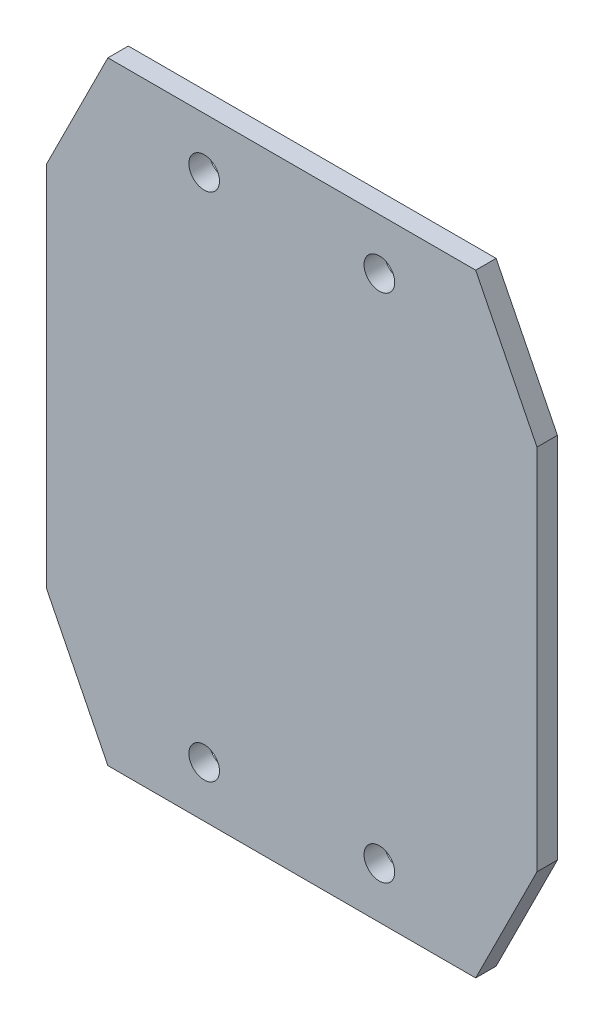
ISO-10303-21;
HEADER;
FILE_DESCRIPTION(('STEP AP214'),'2;1');
FILE_NAME('part.step','',(''),(''),'','','');
FILE_SCHEMA(('AUTOMOTIVE_DESIGN { 1 0 10303 214 1 1 1 1 }'));
ENDSEC;
DATA;
#1=APPLICATION_CONTEXT('core data for automotive mechanical design processes');
#2=APPLICATION_PROTOCOL_DEFINITION('international standard','automotive_design',2000,#1);
#3=PRODUCT_CONTEXT('',#1,'mechanical');
#4=PRODUCT('Part','Part','',(#3));
#5=PRODUCT_RELATED_PRODUCT_CATEGORY('part','',(#4));
#6=PRODUCT_DEFINITION_FORMATION('','',#4);
#7=PRODUCT_DEFINITION_CONTEXT('part definition',#1,'design');
#8=PRODUCT_DEFINITION('design','',#6,#7);
#9=PRODUCT_DEFINITION_SHAPE('','',#8);
#10=(LENGTH_UNIT() NAMED_UNIT(*) SI_UNIT(.MILLI.,.METRE.));
#11=(NAMED_UNIT(*) PLANE_ANGLE_UNIT() SI_UNIT($,.RADIAN.));
#12=(NAMED_UNIT(*) SI_UNIT($,.STERADIAN.) SOLID_ANGLE_UNIT());
#13=UNCERTAINTY_MEASURE_WITH_UNIT(LENGTH_MEASURE(1.E-05),#10,'distance_accuracy_value','');
#14=(GEOMETRIC_REPRESENTATION_CONTEXT(3) GLOBAL_UNCERTAINTY_ASSIGNED_CONTEXT((#13)) GLOBAL_UNIT_ASSIGNED_CONTEXT((#10,
#11,#12)) REPRESENTATION_CONTEXT('',''));
#15=CARTESIAN_POINT('',(0.,0.,0.));
#16=DIRECTION('',(0.,0.,1.));
#17=DIRECTION('',(1.,0.,0.));
#18=AXIS2_PLACEMENT_3D('',#15,#16,#17);
#19=CARTESIAN_POINT('',(0.,0.,10.));
#20=DIRECTION('',(0.,0.,-1.));
#21=DIRECTION('',(-1.,0.,0.));
#22=AXIS2_PLACEMENT_3D('',#19,#20,#21);
#23=PLANE('',#22);
#24=DIRECTION('',(-0.447213595499958,-0.894427190999916,0.));
#25=VECTOR('',#24,1.);
#26=CARTESIAN_POINT('',(-120.,90.,10.));
#27=LINE('',#26,#25);
#28=CARTESIAN_POINT('',(-90.,150.,10.));
#29=VERTEX_POINT('',#28);
#30=CARTESIAN_POINT('',(-120.,90.,10.));
#31=VERTEX_POINT('',#30);
#32=EDGE_CURVE('E144',#29,#31,#27,.T.);
#33=ORIENTED_EDGE('',*,*,#32,.T.);
#34=DIRECTION('',(0.,-1.,0.));
#35=VECTOR('',#34,1.);
#36=CARTESIAN_POINT('',(-120.,-90.,10.));
#37=LINE('',#36,#35);
#38=CARTESIAN_POINT('',(-120.,-90.,10.));
#39=VERTEX_POINT('',#38);
#40=EDGE_CURVE('E92',#31,#39,#37,.T.);
#41=ORIENTED_EDGE('',*,*,#40,.T.);
#42=DIRECTION('',(0.447213595499958,-0.894427190999916,0.));
#43=VECTOR('',#42,1.);
#44=CARTESIAN_POINT('',(-90.,-150.,10.));
#45=LINE('',#44,#43);
#46=CARTESIAN_POINT('',(-90.,-150.,10.));
#47=VERTEX_POINT('',#46);
#48=EDGE_CURVE('E159',#39,#47,#45,.T.);
#49=ORIENTED_EDGE('',*,*,#48,.T.);
#50=DIRECTION('',(1.,0.,0.));
#51=VECTOR('',#50,1.);
#52=CARTESIAN_POINT('',(90.,-150.,10.));
#53=LINE('',#52,#51);
#54=CARTESIAN_POINT('',(90.,-150.,10.));
#55=VERTEX_POINT('',#54);
#56=EDGE_CURVE('E172',#47,#55,#53,.T.);
#57=ORIENTED_EDGE('',*,*,#56,.T.);
#58=DIRECTION('',(0.447213595499958,0.894427190999916,0.));
#59=VECTOR('',#58,1.);
#60=CARTESIAN_POINT('',(120.,-90.,10.));
#61=LINE('',#60,#59);
#62=CARTESIAN_POINT('',(120.,-90.,10.));
#63=VERTEX_POINT('',#62);
#64=EDGE_CURVE('E111',#55,#63,#61,.T.);
#65=ORIENTED_EDGE('',*,*,#64,.T.);
#66=DIRECTION('',(0.,1.,0.));
#67=VECTOR('',#66,1.);
#68=CARTESIAN_POINT('',(120.,90.,10.));
#69=LINE('',#68,#67);
#70=CARTESIAN_POINT('',(120.,90.,10.));
#71=VERTEX_POINT('',#70);
#72=EDGE_CURVE('E105',#63,#71,#69,.T.);
#73=ORIENTED_EDGE('',*,*,#72,.T.);
#74=DIRECTION('',(-0.447213595499958,0.894427190999916,0.));
#75=VECTOR('',#74,1.);
#76=CARTESIAN_POINT('',(90.,150.,10.));
#77=LINE('',#76,#75);
#78=CARTESIAN_POINT('',(90.,150.,10.));
#79=VERTEX_POINT('',#78);
#80=EDGE_CURVE('E109',#71,#79,#77,.T.);
#81=ORIENTED_EDGE('',*,*,#80,.T.);
#82=DIRECTION('',(-1.,0.,0.));
#83=VECTOR('',#82,1.);
#84=CARTESIAN_POINT('',(-90.,150.,10.));
#85=LINE('',#84,#83);
#86=EDGE_CURVE('E49',#79,#29,#85,.T.);
#87=ORIENTED_EDGE('',*,*,#86,.T.);
#88=EDGE_LOOP('',(#33,#41,#49,#57,#65,#73,#81,#87));
#89=FACE_BOUND('',#88,.T.);
#90=CARTESIAN_POINT('',(42.8625,125.,10.));
#91=DIRECTION('',(0.,0.,1.));
#92=DIRECTION('',(1.,0.,0.));
#93=AXIS2_PLACEMENT_3D('',#90,#91,#92);
#94=CIRCLE('',#93,7.5);
#95=CARTESIAN_POINT('',(50.3625,125.,10.));
#96=VERTEX_POINT('',#95);
#97=EDGE_CURVE('E133',#96,#96,#94,.T.);
#98=ORIENTED_EDGE('',*,*,#97,.F.);
#99=EDGE_LOOP('',(#98));
#100=FACE_BOUND('',#99,.T.);
#101=CARTESIAN_POINT('',(-42.8625,125.,10.));
#102=DIRECTION('',(0.,0.,1.));
#103=DIRECTION('',(1.,0.,0.));
#104=AXIS2_PLACEMENT_3D('',#101,#102,#103);
#105=CIRCLE('',#104,7.5);
#106=CARTESIAN_POINT('',(-35.3625,125.,10.));
#107=VERTEX_POINT('',#106);
#108=EDGE_CURVE('E181',#107,#107,#105,.T.);
#109=ORIENTED_EDGE('',*,*,#108,.F.);
#110=EDGE_LOOP('',(#109));
#111=FACE_BOUND('',#110,.T.);
#112=CARTESIAN_POINT('',(-42.8625,-125.,10.));
#113=DIRECTION('',(0.,0.,1.));
#114=DIRECTION('',(1.,0.,0.));
#115=AXIS2_PLACEMENT_3D('',#112,#113,#114);
#116=CIRCLE('',#115,7.5);
#117=CARTESIAN_POINT('',(-35.3625,-125.,10.));
#118=VERTEX_POINT('',#117);
#119=EDGE_CURVE('E187',#118,#118,#116,.T.);
#120=ORIENTED_EDGE('',*,*,#119,.F.);
#121=EDGE_LOOP('',(#120));
#122=FACE_BOUND('',#121,.T.);
#123=CARTESIAN_POINT('',(42.8625,-125.,10.));
#124=DIRECTION('',(0.,0.,1.));
#125=DIRECTION('',(1.,0.,0.));
#126=AXIS2_PLACEMENT_3D('',#123,#124,#125);
#127=CIRCLE('',#126,7.5);
#128=CARTESIAN_POINT('',(50.3625,-125.,10.));
#129=VERTEX_POINT('',#128);
#130=EDGE_CURVE('E193',#129,#129,#127,.T.);
#131=ORIENTED_EDGE('',*,*,#130,.F.);
#132=EDGE_LOOP('',(#131));
#133=FACE_BOUND('',#132,.T.);
#134=ADVANCED_FACE('F32',(#89,#100,#111,#122,#133),#23,.F.);
#135=CARTESIAN_POINT('',(0.,0.,0.));
#136=DIRECTION('',(0.,0.,-1.));
#137=DIRECTION('',(-1.,0.,0.));
#138=AXIS2_PLACEMENT_3D('',#135,#136,#137);
#139=PLANE('',#138);
#140=CARTESIAN_POINT('',(-42.8625,-125.,0.));
#141=DIRECTION('',(0.,0.,1.));
#142=DIRECTION('',(1.,0.,0.));
#143=AXIS2_PLACEMENT_3D('',#140,#141,#142);
#144=CIRCLE('',#143,7.5);
#145=CARTESIAN_POINT('',(-35.3625,-125.,0.));
#146=VERTEX_POINT('',#145);
#147=EDGE_CURVE('E190',#146,#146,#144,.T.);
#148=ORIENTED_EDGE('',*,*,#147,.T.);
#149=EDGE_LOOP('',(#148));
#150=FACE_BOUND('',#149,.T.);
#151=CARTESIAN_POINT('',(42.8625,125.,0.));
#152=DIRECTION('',(0.,0.,1.));
#153=DIRECTION('',(1.,0.,0.));
#154=AXIS2_PLACEMENT_3D('',#151,#152,#153);
#155=CIRCLE('',#154,7.5);
#156=CARTESIAN_POINT('',(50.3625,125.,0.));
#157=VERTEX_POINT('',#156);
#158=EDGE_CURVE('E178',#157,#157,#155,.T.);
#159=ORIENTED_EDGE('',*,*,#158,.T.);
#160=EDGE_LOOP('',(#159));
#161=FACE_BOUND('',#160,.T.);
#162=DIRECTION('',(-0.447213595499958,-0.894427190999916,0.));
#163=VECTOR('',#162,1.);
#164=CARTESIAN_POINT('',(-120.,90.,0.));
#165=LINE('',#164,#163);
#166=CARTESIAN_POINT('',(-90.,150.,0.));
#167=VERTEX_POINT('',#166);
#168=CARTESIAN_POINT('',(-120.,90.,0.));
#169=VERTEX_POINT('',#168);
#170=EDGE_CURVE('E129',#167,#169,#165,.T.);
#171=ORIENTED_EDGE('',*,*,#170,.F.);
#172=DIRECTION('',(-1.,0.,0.));
#173=VECTOR('',#172,1.);
#174=CARTESIAN_POINT('',(-90.,150.,0.));
#175=LINE('',#174,#173);
#176=CARTESIAN_POINT('',(90.,150.,0.));
#177=VERTEX_POINT('',#176);
#178=EDGE_CURVE('E84',#177,#167,#175,.T.);
#179=ORIENTED_EDGE('',*,*,#178,.F.);
#180=DIRECTION('',(-0.447213595499958,0.894427190999916,0.));
#181=VECTOR('',#180,1.);
#182=CARTESIAN_POINT('',(90.,150.,0.));
#183=LINE('',#182,#181);
#184=CARTESIAN_POINT('',(120.,90.,0.));
#185=VERTEX_POINT('',#184);
#186=EDGE_CURVE('E78',#185,#177,#183,.T.);
#187=ORIENTED_EDGE('',*,*,#186,.F.);
#188=DIRECTION('',(0.,1.,0.));
#189=VECTOR('',#188,1.);
#190=CARTESIAN_POINT('',(120.,90.,0.));
#191=LINE('',#190,#189);
#192=CARTESIAN_POINT('',(120.,-90.,0.));
#193=VERTEX_POINT('',#192);
#194=EDGE_CURVE('E119',#193,#185,#191,.T.);
#195=ORIENTED_EDGE('',*,*,#194,.F.);
#196=DIRECTION('',(0.447213595499958,0.894427190999916,0.));
#197=VECTOR('',#196,1.);
#198=CARTESIAN_POINT('',(120.,-90.,0.));
#199=LINE('',#198,#197);
#200=CARTESIAN_POINT('',(90.,-150.,0.));
#201=VERTEX_POINT('',#200);
#202=EDGE_CURVE('E139',#201,#193,#199,.T.);
#203=ORIENTED_EDGE('',*,*,#202,.F.);
#204=DIRECTION('',(1.,0.,0.));
#205=VECTOR('',#204,1.);
#206=CARTESIAN_POINT('',(90.,-150.,0.));
#207=LINE('',#206,#205);
#208=CARTESIAN_POINT('',(-90.,-150.,0.));
#209=VERTEX_POINT('',#208);
#210=EDGE_CURVE('E137',#209,#201,#207,.T.);
#211=ORIENTED_EDGE('',*,*,#210,.F.);
#212=DIRECTION('',(0.447213595499958,-0.894427190999916,0.));
#213=VECTOR('',#212,1.);
#214=CARTESIAN_POINT('',(-90.,-150.,0.));
#215=LINE('',#214,#213);
#216=CARTESIAN_POINT('',(-120.,-90.,0.));
#217=VERTEX_POINT('',#216);
#218=EDGE_CURVE('E135',#217,#209,#215,.T.);
#219=ORIENTED_EDGE('',*,*,#218,.F.);
#220=DIRECTION('',(0.,-1.,0.));
#221=VECTOR('',#220,1.);
#222=CARTESIAN_POINT('',(-120.,-90.,0.));
#223=LINE('',#222,#221);
#224=EDGE_CURVE('E132',#169,#217,#223,.T.);
#225=ORIENTED_EDGE('',*,*,#224,.F.);
#226=EDGE_LOOP('',(#171,#179,#187,#195,#203,#211,#219,#225));
#227=FACE_BOUND('',#226,.T.);
#228=CARTESIAN_POINT('',(-42.8625,125.,0.));
#229=DIRECTION('',(0.,0.,1.));
#230=DIRECTION('',(1.,0.,0.));
#231=AXIS2_PLACEMENT_3D('',#228,#229,#230);
#232=CIRCLE('',#231,7.5);
#233=CARTESIAN_POINT('',(-35.3625,125.,0.));
#234=VERTEX_POINT('',#233);
#235=EDGE_CURVE('E184',#234,#234,#232,.T.);
#236=ORIENTED_EDGE('',*,*,#235,.T.);
#237=EDGE_LOOP('',(#236));
#238=FACE_BOUND('',#237,.T.);
#239=CARTESIAN_POINT('',(42.8625,-125.,0.));
#240=DIRECTION('',(0.,0.,1.));
#241=DIRECTION('',(1.,0.,0.));
#242=AXIS2_PLACEMENT_3D('',#239,#240,#241);
#243=CIRCLE('',#242,7.5);
#244=CARTESIAN_POINT('',(50.3625,-125.,0.));
#245=VERTEX_POINT('',#244);
#246=EDGE_CURVE('E196',#245,#245,#243,.T.);
#247=ORIENTED_EDGE('',*,*,#246,.T.);
#248=EDGE_LOOP('',(#247));
#249=FACE_BOUND('',#248,.T.);
#250=ADVANCED_FACE('F163',(#150,#161,#227,#238,#249),#139,.T.);
#251=CARTESIAN_POINT('',(-120.,90.,10.));
#252=DIRECTION('',(0.894427190999916,-0.447213595499958,0.));
#253=DIRECTION('',(0.447213595499958,0.894427190999916,0.));
#254=AXIS2_PLACEMENT_3D('',#251,#252,#253);
#255=PLANE('',#254);
#256=ORIENTED_EDGE('',*,*,#170,.T.);
#257=DIRECTION('',(0.,0.,-1.));
#258=VECTOR('',#257,1.);
#259=CARTESIAN_POINT('',(-120.,90.,10.));
#260=LINE('',#259,#258);
#261=EDGE_CURVE('E11',#31,#169,#260,.T.);
#262=ORIENTED_EDGE('',*,*,#261,.F.);
#263=ORIENTED_EDGE('',*,*,#32,.F.);
#264=DIRECTION('',(0.,0.,-1.));
#265=VECTOR('',#264,1.);
#266=CARTESIAN_POINT('',(-90.,150.,10.));
#267=LINE('',#266,#265);
#268=EDGE_CURVE('E125',#29,#167,#267,.T.);
#269=ORIENTED_EDGE('',*,*,#268,.T.);
#270=EDGE_LOOP('',(#256,#262,#263,#269));
#271=FACE_BOUND('',#270,.T.);
#272=ADVANCED_FACE('F34',(#271),#255,.F.);
#273=CARTESIAN_POINT('',(-120.,-90.,10.));
#274=DIRECTION('',(1.,0.,0.));
#275=DIRECTION('',(0.,0.,-1.));
#276=AXIS2_PLACEMENT_3D('',#273,#274,#275);
#277=PLANE('',#276);
#278=ORIENTED_EDGE('',*,*,#224,.T.);
#279=DIRECTION('',(0.,0.,-1.));
#280=VECTOR('',#279,1.);
#281=CARTESIAN_POINT('',(-120.,-90.,10.));
#282=LINE('',#281,#280);
#283=EDGE_CURVE('E41',#39,#217,#282,.T.);
#284=ORIENTED_EDGE('',*,*,#283,.F.);
#285=ORIENTED_EDGE('',*,*,#40,.F.);
#286=ORIENTED_EDGE('',*,*,#261,.T.);
#287=EDGE_LOOP('',(#278,#284,#285,#286));
#288=FACE_BOUND('',#287,.T.);
#289=ADVANCED_FACE('F228',(#288),#277,.F.);
#290=CARTESIAN_POINT('',(-90.,-150.,10.));
#291=DIRECTION('',(0.894427190999916,0.447213595499958,0.));
#292=DIRECTION('',(-0.447213595499958,0.894427190999916,0.));
#293=AXIS2_PLACEMENT_3D('',#290,#291,#292);
#294=PLANE('',#293);
#295=ORIENTED_EDGE('',*,*,#218,.T.);
#296=DIRECTION('',(0.,0.,-1.));
#297=VECTOR('',#296,1.);
#298=CARTESIAN_POINT('',(-90.,-150.,10.));
#299=LINE('',#298,#297);
#300=EDGE_CURVE('E151',#47,#209,#299,.T.);
#301=ORIENTED_EDGE('',*,*,#300,.F.);
#302=ORIENTED_EDGE('',*,*,#48,.F.);
#303=ORIENTED_EDGE('',*,*,#283,.T.);
#304=EDGE_LOOP('',(#295,#301,#302,#303));
#305=FACE_BOUND('',#304,.T.);
#306=ADVANCED_FACE('F157',(#305),#294,.F.);
#307=CARTESIAN_POINT('',(90.,-150.,10.));
#308=DIRECTION('',(0.,1.,0.));
#309=DIRECTION('',(-1.,0.,0.));
#310=AXIS2_PLACEMENT_3D('',#307,#308,#309);
#311=PLANE('',#310);
#312=ORIENTED_EDGE('',*,*,#210,.T.);
#313=DIRECTION('',(0.,0.,-1.));
#314=VECTOR('',#313,1.);
#315=CARTESIAN_POINT('',(90.,-150.,10.));
#316=LINE('',#315,#314);
#317=EDGE_CURVE('E148',#55,#201,#316,.T.);
#318=ORIENTED_EDGE('',*,*,#317,.F.);
#319=ORIENTED_EDGE('',*,*,#56,.F.);
#320=ORIENTED_EDGE('',*,*,#300,.T.);
#321=EDGE_LOOP('',(#312,#318,#319,#320));
#322=FACE_BOUND('',#321,.T.);
#323=ADVANCED_FACE('F168',(#322),#311,.F.);
#324=CARTESIAN_POINT('',(120.,-90.,10.));
#325=DIRECTION('',(-0.894427190999916,0.447213595499958,0.));
#326=DIRECTION('',(-0.447213595499958,-0.894427190999916,0.));
#327=AXIS2_PLACEMENT_3D('',#324,#325,#326);
#328=PLANE('',#327);
#329=ORIENTED_EDGE('',*,*,#202,.T.);
#330=DIRECTION('',(0.,0.,-1.));
#331=VECTOR('',#330,1.);
#332=CARTESIAN_POINT('',(120.,-90.,10.));
#333=LINE('',#332,#331);
#334=EDGE_CURVE('E120',#63,#193,#333,.T.);
#335=ORIENTED_EDGE('',*,*,#334,.F.);
#336=ORIENTED_EDGE('',*,*,#64,.F.);
#337=ORIENTED_EDGE('',*,*,#317,.T.);
#338=EDGE_LOOP('',(#329,#335,#336,#337));
#339=FACE_BOUND('',#338,.T.);
#340=ADVANCED_FACE('F171',(#339),#328,.F.);
#341=CARTESIAN_POINT('',(120.,90.,10.));
#342=DIRECTION('',(-1.,0.,0.));
#343=DIRECTION('',(0.,0.,1.));
#344=AXIS2_PLACEMENT_3D('',#341,#342,#343);
#345=PLANE('',#344);
#346=ORIENTED_EDGE('',*,*,#194,.T.);
#347=DIRECTION('',(0.,0.,-1.));
#348=VECTOR('',#347,1.);
#349=CARTESIAN_POINT('',(120.,90.,10.));
#350=LINE('',#349,#348);
#351=EDGE_CURVE('E116',#71,#185,#350,.T.);
#352=ORIENTED_EDGE('',*,*,#351,.F.);
#353=ORIENTED_EDGE('',*,*,#72,.F.);
#354=ORIENTED_EDGE('',*,*,#334,.T.);
#355=EDGE_LOOP('',(#346,#352,#353,#354));
#356=FACE_BOUND('',#355,.T.);
#357=ADVANCED_FACE('F117',(#356),#345,.F.);
#358=CARTESIAN_POINT('',(90.,150.,10.));
#359=DIRECTION('',(-0.894427190999916,-0.447213595499958,0.));
#360=DIRECTION('',(0.447213595499958,-0.894427190999916,0.));
#361=AXIS2_PLACEMENT_3D('',#358,#359,#360);
#362=PLANE('',#361);
#363=ORIENTED_EDGE('',*,*,#186,.T.);
#364=DIRECTION('',(0.,0.,-1.));
#365=VECTOR('',#364,1.);
#366=CARTESIAN_POINT('',(90.,150.,10.));
#367=LINE('',#366,#365);
#368=EDGE_CURVE('E121',#79,#177,#367,.T.);
#369=ORIENTED_EDGE('',*,*,#368,.F.);
#370=ORIENTED_EDGE('',*,*,#80,.F.);
#371=ORIENTED_EDGE('',*,*,#351,.T.);
#372=EDGE_LOOP('',(#363,#369,#370,#371));
#373=FACE_BOUND('',#372,.T.);
#374=ADVANCED_FACE('F123',(#373),#362,.F.);
#375=CARTESIAN_POINT('',(-90.,150.,10.));
#376=DIRECTION('',(0.,-1.,0.));
#377=DIRECTION('',(0.,0.,-1.));
#378=AXIS2_PLACEMENT_3D('',#375,#376,#377);
#379=PLANE('',#378);
#380=ORIENTED_EDGE('',*,*,#178,.T.);
#381=ORIENTED_EDGE('',*,*,#268,.F.);
#382=ORIENTED_EDGE('',*,*,#86,.F.);
#383=ORIENTED_EDGE('',*,*,#368,.T.);
#384=EDGE_LOOP('',(#380,#381,#382,#383));
#385=FACE_BOUND('',#384,.T.);
#386=ADVANCED_FACE('F216',(#385),#379,.F.);
#387=CARTESIAN_POINT('',(42.8625,125.,10.));
#388=DIRECTION('',(0.,0.,-1.));
#389=DIRECTION('',(-1.,0.,0.));
#390=AXIS2_PLACEMENT_3D('',#387,#388,#389);
#391=CYLINDRICAL_SURFACE('',#390,7.5);
#392=ORIENTED_EDGE('',*,*,#97,.T.);
#393=EDGE_LOOP('',(#392));
#394=FACE_BOUND('',#393,.T.);
#395=ORIENTED_EDGE('',*,*,#158,.F.);
#396=EDGE_LOOP('',(#395));
#397=FACE_BOUND('',#396,.T.);
#398=ADVANCED_FACE('F213',(#394,#397),#391,.F.);
#399=CARTESIAN_POINT('',(-42.8625,125.,10.));
#400=DIRECTION('',(0.,0.,-1.));
#401=DIRECTION('',(-1.,0.,0.));
#402=AXIS2_PLACEMENT_3D('',#399,#400,#401);
#403=CYLINDRICAL_SURFACE('',#402,7.5);
#404=ORIENTED_EDGE('',*,*,#108,.T.);
#405=EDGE_LOOP('',(#404));
#406=FACE_BOUND('',#405,.T.);
#407=ORIENTED_EDGE('',*,*,#235,.F.);
#408=EDGE_LOOP('',(#407));
#409=FACE_BOUND('',#408,.T.);
#410=ADVANCED_FACE('F292',(#406,#409),#403,.F.);
#411=CARTESIAN_POINT('',(-42.8625,-125.,10.));
#412=DIRECTION('',(0.,0.,-1.));
#413=DIRECTION('',(-1.,0.,0.));
#414=AXIS2_PLACEMENT_3D('',#411,#412,#413);
#415=CYLINDRICAL_SURFACE('',#414,7.5);
#416=ORIENTED_EDGE('',*,*,#119,.T.);
#417=EDGE_LOOP('',(#416));
#418=FACE_BOUND('',#417,.T.);
#419=ORIENTED_EDGE('',*,*,#147,.F.);
#420=EDGE_LOOP('',(#419));
#421=FACE_BOUND('',#420,.T.);
#422=ADVANCED_FACE('F300',(#418,#421),#415,.F.);
#423=CARTESIAN_POINT('',(42.8625,-125.,10.));
#424=DIRECTION('',(0.,0.,-1.));
#425=DIRECTION('',(-1.,0.,0.));
#426=AXIS2_PLACEMENT_3D('',#423,#424,#425);
#427=CYLINDRICAL_SURFACE('',#426,7.5);
#428=ORIENTED_EDGE('',*,*,#130,.T.);
#429=EDGE_LOOP('',(#428));
#430=FACE_BOUND('',#429,.T.);
#431=ORIENTED_EDGE('',*,*,#246,.F.);
#432=EDGE_LOOP('',(#431));
#433=FACE_BOUND('',#432,.T.);
#434=ADVANCED_FACE('F202',(#430,#433),#427,.F.);
#435=CLOSED_SHELL('',(#134,#250,#272,#289,#306,#323,#340,#357,#374,#386,#398,#410,#422,#434));
#436=MANIFOLD_SOLID_BREP('B2',#435);
#437=ADVANCED_BREP_SHAPE_REPRESENTATION('',(#18,#436),#14);
#438=SHAPE_DEFINITION_REPRESENTATION(#9,#437);
ENDSEC;
END-ISO-10303-21;
